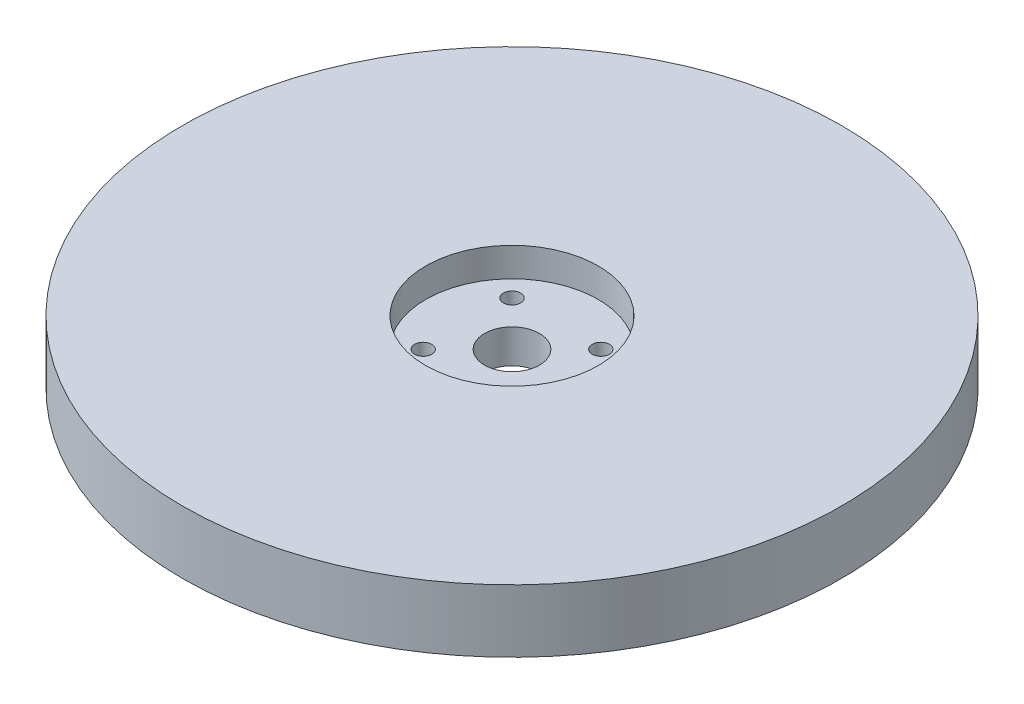
ISO-10303-21;
HEADER;
FILE_DESCRIPTION(('STEP AP214'),'2;1');
FILE_NAME('part.step','',(''),(''),'','','');
FILE_SCHEMA(('AUTOMOTIVE_DESIGN { 1 0 10303 214 1 1 1 1 }'));
ENDSEC;
DATA;
#1=APPLICATION_CONTEXT('core data for automotive mechanical design processes');
#2=APPLICATION_PROTOCOL_DEFINITION('international standard','automotive_design',2000,#1);
#3=PRODUCT_CONTEXT('',#1,'mechanical');
#4=PRODUCT('Part','Part','',(#3));
#5=PRODUCT_RELATED_PRODUCT_CATEGORY('part','',(#4));
#6=PRODUCT_DEFINITION_FORMATION('','',#4);
#7=PRODUCT_DEFINITION_CONTEXT('part definition',#1,'design');
#8=PRODUCT_DEFINITION('design','',#6,#7);
#9=PRODUCT_DEFINITION_SHAPE('','',#8);
#10=(LENGTH_UNIT() NAMED_UNIT(*) SI_UNIT(.MILLI.,.METRE.));
#11=(NAMED_UNIT(*) PLANE_ANGLE_UNIT() SI_UNIT($,.RADIAN.));
#12=(NAMED_UNIT(*) SI_UNIT($,.STERADIAN.) SOLID_ANGLE_UNIT());
#13=UNCERTAINTY_MEASURE_WITH_UNIT(LENGTH_MEASURE(1.E-05),#10,'distance_accuracy_value','');
#14=(GEOMETRIC_REPRESENTATION_CONTEXT(3) GLOBAL_UNCERTAINTY_ASSIGNED_CONTEXT((#13)) GLOBAL_UNIT_ASSIGNED_CONTEXT((#10,
#11,#12)) REPRESENTATION_CONTEXT('',''));
#15=CARTESIAN_POINT('',(0.,0.,0.));
#16=DIRECTION('',(0.,0.,1.));
#17=DIRECTION('',(1.,0.,0.));
#18=AXIS2_PLACEMENT_3D('',#15,#16,#17);
#19=CARTESIAN_POINT('',(0.,8.,0.));
#20=DIRECTION('',(0.,-1.,0.));
#21=DIRECTION('',(0.,0.,-1.));
#22=AXIS2_PLACEMENT_3D('',#19,#20,#21);
#23=CYLINDRICAL_SURFACE('',#22,3.5);
#24=CARTESIAN_POINT('',(0.,0.,0.));
#25=DIRECTION('',(0.,-1.,0.));
#26=DIRECTION('',(0.,0.,-1.));
#27=AXIS2_PLACEMENT_3D('',#24,#25,#26);
#28=CIRCLE('',#27,3.5);
#29=CARTESIAN_POINT('',(0.,0.,-3.5));
#30=VERTEX_POINT('',#29);
#31=EDGE_CURVE('E49',#30,#30,#28,.T.);
#32=ORIENTED_EDGE('',*,*,#31,.T.);
#33=EDGE_LOOP('',(#32));
#34=FACE_BOUND('',#33,.T.);
#35=CARTESIAN_POINT('',(0.,4.3,0.));
#36=DIRECTION('',(0.,1.,0.));
#37=DIRECTION('',(0.,0.,1.));
#38=AXIS2_PLACEMENT_3D('',#35,#36,#37);
#39=CIRCLE('',#38,3.5);
#40=CARTESIAN_POINT('',(0.,4.3,3.5));
#41=VERTEX_POINT('',#40);
#42=EDGE_CURVE('E41',#41,#41,#39,.F.);
#43=ORIENTED_EDGE('',*,*,#42,.F.);
#44=EDGE_LOOP('',(#43));
#45=FACE_BOUND('',#44,.T.);
#46=ADVANCED_FACE('F40',(#34,#45),#23,.F.);
#47=CARTESIAN_POINT('',(0.,8.,0.));
#48=DIRECTION('',(0.,-1.,0.));
#49=DIRECTION('',(0.,0.,-1.));
#50=AXIS2_PLACEMENT_3D('',#47,#48,#49);
#51=CYLINDRICAL_SURFACE('',#50,42.);
#52=CARTESIAN_POINT('',(0.,8.,0.));
#53=DIRECTION('',(0.,1.,0.));
#54=DIRECTION('',(0.,0.,1.));
#55=AXIS2_PLACEMENT_3D('',#52,#53,#54);
#56=CIRCLE('',#55,42.);
#57=CARTESIAN_POINT('',(0.,8.,42.));
#58=VERTEX_POINT('',#57);
#59=EDGE_CURVE('E10',#58,#58,#56,.T.);
#60=ORIENTED_EDGE('',*,*,#59,.F.);
#61=EDGE_LOOP('',(#60));
#62=FACE_BOUND('',#61,.T.);
#63=CARTESIAN_POINT('',(0.,0.,0.));
#64=DIRECTION('',(0.,1.,0.));
#65=DIRECTION('',(0.,0.,1.));
#66=AXIS2_PLACEMENT_3D('',#63,#64,#65);
#67=CIRCLE('',#66,42.);
#68=CARTESIAN_POINT('',(0.,0.,42.));
#69=VERTEX_POINT('',#68);
#70=EDGE_CURVE('E44',#69,#69,#67,.T.);
#71=ORIENTED_EDGE('',*,*,#70,.T.);
#72=EDGE_LOOP('',(#71));
#73=FACE_BOUND('',#72,.T.);
#74=ADVANCED_FACE('F39',(#62,#73),#51,.T.);
#75=CARTESIAN_POINT('',(0.,8.,0.));
#76=DIRECTION('',(0.,1.,0.));
#77=DIRECTION('',(0.,0.,1.));
#78=AXIS2_PLACEMENT_3D('',#75,#76,#77);
#79=PLANE('',#78);
#80=CARTESIAN_POINT('',(0.,8.,0.));
#81=DIRECTION('',(0.,1.,0.));
#82=DIRECTION('',(0.,0.,1.));
#83=AXIS2_PLACEMENT_3D('',#80,#81,#82);
#84=CIRCLE('',#83,11.);
#85=CARTESIAN_POINT('',(0.,8.,11.));
#86=VERTEX_POINT('',#85);
#87=EDGE_CURVE('E53',#86,#86,#84,.T.);
#88=ORIENTED_EDGE('',*,*,#87,.F.);
#89=EDGE_LOOP('',(#88));
#90=FACE_BOUND('',#89,.T.);
#91=ORIENTED_EDGE('',*,*,#59,.T.);
#92=EDGE_LOOP('',(#91));
#93=FACE_BOUND('',#92,.T.);
#94=ADVANCED_FACE('F113',(#90,#93),#79,.T.);
#95=CARTESIAN_POINT('',(0.,0.,0.));
#96=DIRECTION('',(0.,1.,0.));
#97=DIRECTION('',(0.,0.,1.));
#98=AXIS2_PLACEMENT_3D('',#95,#96,#97);
#99=PLANE('',#98);
#100=CARTESIAN_POINT('',(12.,0.,-12.));
#101=DIRECTION('',(0.,-1.,0.));
#102=DIRECTION('',(0.,0.,1.));
#103=AXIS2_PLACEMENT_3D('',#100,#101,#102);
#104=CIRCLE('',#103,1.25);
#105=CARTESIAN_POINT('',(12.,0.,-10.75));
#106=VERTEX_POINT('',#105);
#107=EDGE_CURVE('E86',#106,#106,#104,.T.);
#108=ORIENTED_EDGE('',*,*,#107,.F.);
#109=EDGE_LOOP('',(#108));
#110=FACE_BOUND('',#109,.T.);
#111=CARTESIAN_POINT('',(-24.,0.,12.));
#112=DIRECTION('',(0.,-1.,0.));
#113=DIRECTION('',(0.,0.,-1.));
#114=AXIS2_PLACEMENT_3D('',#111,#112,#113);
#115=CIRCLE('',#114,1.25);
#116=CARTESIAN_POINT('',(-24.,0.,10.75));
#117=VERTEX_POINT('',#116);
#118=EDGE_CURVE('E94',#117,#117,#115,.T.);
#119=ORIENTED_EDGE('',*,*,#118,.F.);
#120=EDGE_LOOP('',(#119));
#121=FACE_BOUND('',#120,.T.);
#122=CARTESIAN_POINT('',(-24.,0.,-12.));
#123=DIRECTION('',(0.,-1.,0.));
#124=DIRECTION('',(0.,0.,1.));
#125=AXIS2_PLACEMENT_3D('',#122,#123,#124);
#126=CIRCLE('',#125,1.25);
#127=CARTESIAN_POINT('',(-24.,0.,-10.75));
#128=VERTEX_POINT('',#127);
#129=EDGE_CURVE('E92',#128,#128,#126,.T.);
#130=ORIENTED_EDGE('',*,*,#129,.F.);
#131=EDGE_LOOP('',(#130));
#132=FACE_BOUND('',#131,.T.);
#133=CARTESIAN_POINT('',(12.,0.,12.));
#134=DIRECTION('',(0.,-1.,0.));
#135=DIRECTION('',(0.,0.,-1.));
#136=AXIS2_PLACEMENT_3D('',#133,#134,#135);
#137=CIRCLE('',#136,1.25);
#138=CARTESIAN_POINT('',(12.,0.,10.75));
#139=VERTEX_POINT('',#138);
#140=EDGE_CURVE('E84',#139,#139,#137,.T.);
#141=ORIENTED_EDGE('',*,*,#140,.F.);
#142=EDGE_LOOP('',(#141));
#143=FACE_BOUND('',#142,.T.);
#144=ORIENTED_EDGE('',*,*,#31,.F.);
#145=EDGE_LOOP('',(#144));
#146=FACE_BOUND('',#145,.T.);
#147=ORIENTED_EDGE('',*,*,#70,.F.);
#148=EDGE_LOOP('',(#147));
#149=FACE_BOUND('',#148,.T.);
#150=ADVANCED_FACE('F112',(#110,#121,#132,#143,#146,#149),#99,.F.);
#151=CARTESIAN_POINT('',(0.,4.3,0.));
#152=DIRECTION('',(0.,1.,0.));
#153=DIRECTION('',(0.,0.,1.));
#154=AXIS2_PLACEMENT_3D('',#151,#152,#153);
#155=PLANE('',#154);
#156=CARTESIAN_POINT('',(-5.66000000000006,4.3,5.65999999999994));
#157=DIRECTION('',(0.,1.,0.));
#158=DIRECTION('',(0.,0.,1.));
#159=AXIS2_PLACEMENT_3D('',#156,#157,#158);
#160=CIRCLE('',#159,1.1);
#161=CARTESIAN_POINT('',(-5.66000000000006,4.3,6.75999999999994));
#162=VERTEX_POINT('',#161);
#163=EDGE_CURVE('E69',#162,#162,#160,.T.);
#164=ORIENTED_EDGE('',*,*,#163,.F.);
#165=EDGE_LOOP('',(#164));
#166=FACE_BOUND('',#165,.T.);
#167=CARTESIAN_POINT('',(5.65999999999996,4.3,5.66000000000008));
#168=DIRECTION('',(0.,1.,0.));
#169=DIRECTION('',(0.,0.,1.));
#170=AXIS2_PLACEMENT_3D('',#167,#168,#169);
#171=CIRCLE('',#170,1.09999999999999);
#172=CARTESIAN_POINT('',(5.65999999999996,4.3,6.76000000000007));
#173=VERTEX_POINT('',#172);
#174=EDGE_CURVE('E76',#173,#173,#171,.T.);
#175=ORIENTED_EDGE('',*,*,#174,.F.);
#176=EDGE_LOOP('',(#175));
#177=FACE_BOUND('',#176,.T.);
#178=CARTESIAN_POINT('',(5.66000000000002,4.3,-5.65999999999998));
#179=DIRECTION('',(0.,1.,0.));
#180=DIRECTION('',(0.,0.,1.));
#181=AXIS2_PLACEMENT_3D('',#178,#179,#180);
#182=CIRCLE('',#181,1.1);
#183=CARTESIAN_POINT('',(5.66000000000002,4.3,-4.55999999999998));
#184=VERTEX_POINT('',#183);
#185=EDGE_CURVE('E63',#184,#184,#182,.T.);
#186=ORIENTED_EDGE('',*,*,#185,.F.);
#187=EDGE_LOOP('',(#186));
#188=FACE_BOUND('',#187,.T.);
#189=CARTESIAN_POINT('',(-5.66,4.3,-5.66));
#190=DIRECTION('',(0.,1.,0.));
#191=DIRECTION('',(0.,0.,1.));
#192=AXIS2_PLACEMENT_3D('',#189,#190,#191);
#193=CIRCLE('',#192,1.1);
#194=CARTESIAN_POINT('',(-5.66,4.3,-4.56));
#195=VERTEX_POINT('',#194);
#196=EDGE_CURVE('E64',#195,#195,#193,.T.);
#197=ORIENTED_EDGE('',*,*,#196,.F.);
#198=EDGE_LOOP('',(#197));
#199=FACE_BOUND('',#198,.T.);
#200=CARTESIAN_POINT('',(0.,4.3,0.));
#201=DIRECTION('',(0.,1.,0.));
#202=DIRECTION('',(0.,0.,1.));
#203=AXIS2_PLACEMENT_3D('',#200,#201,#202);
#204=CIRCLE('',#203,11.);
#205=CARTESIAN_POINT('',(0.,4.3,11.));
#206=VERTEX_POINT('',#205);
#207=EDGE_CURVE('E60',#206,#206,#204,.T.);
#208=ORIENTED_EDGE('',*,*,#207,.T.);
#209=EDGE_LOOP('',(#208));
#210=FACE_BOUND('',#209,.T.);
#211=ORIENTED_EDGE('',*,*,#42,.T.);
#212=EDGE_LOOP('',(#211));
#213=FACE_BOUND('',#212,.T.);
#214=ADVANCED_FACE('F111',(#166,#177,#188,#199,#210,#213),#155,.T.);
#215=CARTESIAN_POINT('',(0.,4.3,0.));
#216=DIRECTION('',(0.,1.,0.));
#217=DIRECTION('',(0.,0.,1.));
#218=AXIS2_PLACEMENT_3D('',#215,#216,#217);
#219=CYLINDRICAL_SURFACE('',#218,11.);
#220=ORIENTED_EDGE('',*,*,#207,.F.);
#221=EDGE_LOOP('',(#220));
#222=FACE_BOUND('',#221,.T.);
#223=ORIENTED_EDGE('',*,*,#87,.T.);
#224=EDGE_LOOP('',(#223));
#225=FACE_BOUND('',#224,.T.);
#226=ADVANCED_FACE('F140',(#222,#225),#219,.F.);
#227=CARTESIAN_POINT('',(-5.66,1.3,-5.66));
#228=DIRECTION('',(0.,1.,0.));
#229=DIRECTION('',(0.,0.,1.));
#230=AXIS2_PLACEMENT_3D('',#227,#228,#229);
#231=CYLINDRICAL_SURFACE('',#230,1.1);
#232=CARTESIAN_POINT('',(-5.66,1.3,-5.66));
#233=DIRECTION('',(0.,1.,0.));
#234=DIRECTION('',(0.,0.,1.));
#235=AXIS2_PLACEMENT_3D('',#232,#233,#234);
#236=CIRCLE('',#235,1.1);
#237=CARTESIAN_POINT('',(-5.66,1.3,-4.56));
#238=VERTEX_POINT('',#237);
#239=EDGE_CURVE('E59',#238,#238,#236,.T.);
#240=ORIENTED_EDGE('',*,*,#239,.F.);
#241=EDGE_LOOP('',(#240));
#242=FACE_BOUND('',#241,.T.);
#243=ORIENTED_EDGE('',*,*,#196,.T.);
#244=EDGE_LOOP('',(#243));
#245=FACE_BOUND('',#244,.T.);
#246=ADVANCED_FACE('F139',(#242,#245),#231,.F.);
#247=CARTESIAN_POINT('',(-5.66,1.3,-5.66));
#248=DIRECTION('',(0.,1.,0.));
#249=DIRECTION('',(0.,0.,1.));
#250=AXIS2_PLACEMENT_3D('',#247,#248,#249);
#251=PLANE('',#250);
#252=ORIENTED_EDGE('',*,*,#239,.T.);
#253=EDGE_LOOP('',(#252));
#254=FACE_BOUND('',#253,.T.);
#255=ADVANCED_FACE('F150',(#254),#251,.T.);
#256=CARTESIAN_POINT('',(5.66000000000002,1.3,-5.65999999999998));
#257=DIRECTION('',(0.,1.,0.));
#258=DIRECTION('',(0.,0.,1.));
#259=AXIS2_PLACEMENT_3D('',#256,#257,#258);
#260=CYLINDRICAL_SURFACE('',#259,1.1);
#261=CARTESIAN_POINT('',(5.66000000000002,1.3,-5.65999999999998));
#262=DIRECTION('',(0.,1.,0.));
#263=DIRECTION('',(0.,0.,1.));
#264=AXIS2_PLACEMENT_3D('',#261,#262,#263);
#265=CIRCLE('',#264,1.1);
#266=CARTESIAN_POINT('',(5.66000000000002,1.3,-4.55999999999998));
#267=VERTEX_POINT('',#266);
#268=EDGE_CURVE('E77',#267,#267,#265,.T.);
#269=ORIENTED_EDGE('',*,*,#268,.F.);
#270=EDGE_LOOP('',(#269));
#271=FACE_BOUND('',#270,.T.);
#272=ORIENTED_EDGE('',*,*,#185,.T.);
#273=EDGE_LOOP('',(#272));
#274=FACE_BOUND('',#273,.T.);
#275=ADVANCED_FACE('F151',(#271,#274),#260,.F.);
#276=CARTESIAN_POINT('',(5.66000000000002,1.3,-5.65999999999998));
#277=DIRECTION('',(0.,1.,0.));
#278=DIRECTION('',(0.,0.,1.));
#279=AXIS2_PLACEMENT_3D('',#276,#277,#278);
#280=PLANE('',#279);
#281=ORIENTED_EDGE('',*,*,#268,.T.);
#282=EDGE_LOOP('',(#281));
#283=FACE_BOUND('',#282,.T.);
#284=ADVANCED_FACE('F166',(#283),#280,.T.);
#285=CARTESIAN_POINT('',(5.65999999999996,1.3,5.66000000000008));
#286=DIRECTION('',(0.,1.,0.));
#287=DIRECTION('',(0.,0.,1.));
#288=AXIS2_PLACEMENT_3D('',#285,#286,#287);
#289=CYLINDRICAL_SURFACE('',#288,1.09999999999999);
#290=CARTESIAN_POINT('',(5.65999999999996,1.3,5.66000000000008));
#291=DIRECTION('',(0.,1.,0.));
#292=DIRECTION('',(0.,0.,1.));
#293=AXIS2_PLACEMENT_3D('',#290,#291,#292);
#294=CIRCLE('',#293,1.09999999999999);
#295=CARTESIAN_POINT('',(5.65999999999996,1.3,6.76000000000007));
#296=VERTEX_POINT('',#295);
#297=EDGE_CURVE('E74',#296,#296,#294,.T.);
#298=ORIENTED_EDGE('',*,*,#297,.F.);
#299=EDGE_LOOP('',(#298));
#300=FACE_BOUND('',#299,.T.);
#301=ORIENTED_EDGE('',*,*,#174,.T.);
#302=EDGE_LOOP('',(#301));
#303=FACE_BOUND('',#302,.T.);
#304=ADVANCED_FACE('F164',(#300,#303),#289,.F.);
#305=CARTESIAN_POINT('',(5.65999999999996,1.3,5.66000000000008));
#306=DIRECTION('',(0.,1.,0.));
#307=DIRECTION('',(0.,0.,1.));
#308=AXIS2_PLACEMENT_3D('',#305,#306,#307);
#309=PLANE('',#308);
#310=ORIENTED_EDGE('',*,*,#297,.T.);
#311=EDGE_LOOP('',(#310));
#312=FACE_BOUND('',#311,.T.);
#313=ADVANCED_FACE('F161',(#312),#309,.T.);
#314=CARTESIAN_POINT('',(-5.66000000000006,1.3,5.65999999999994));
#315=DIRECTION('',(0.,1.,0.));
#316=DIRECTION('',(0.,0.,1.));
#317=AXIS2_PLACEMENT_3D('',#314,#315,#316);
#318=CYLINDRICAL_SURFACE('',#317,1.1);
#319=CARTESIAN_POINT('',(-5.66000000000006,1.3,5.65999999999994));
#320=DIRECTION('',(0.,1.,0.));
#321=DIRECTION('',(0.,0.,1.));
#322=AXIS2_PLACEMENT_3D('',#319,#320,#321);
#323=CIRCLE('',#322,1.1);
#324=CARTESIAN_POINT('',(-5.66000000000006,1.3,6.75999999999994));
#325=VERTEX_POINT('',#324);
#326=EDGE_CURVE('E70',#325,#325,#323,.T.);
#327=ORIENTED_EDGE('',*,*,#326,.F.);
#328=EDGE_LOOP('',(#327));
#329=FACE_BOUND('',#328,.T.);
#330=ORIENTED_EDGE('',*,*,#163,.T.);
#331=EDGE_LOOP('',(#330));
#332=FACE_BOUND('',#331,.T.);
#333=ADVANCED_FACE('F160',(#329,#332),#318,.F.);
#334=CARTESIAN_POINT('',(-5.66000000000006,1.3,5.65999999999994));
#335=DIRECTION('',(0.,1.,0.));
#336=DIRECTION('',(0.,0.,1.));
#337=AXIS2_PLACEMENT_3D('',#334,#335,#336);
#338=PLANE('',#337);
#339=ORIENTED_EDGE('',*,*,#326,.T.);
#340=EDGE_LOOP('',(#339));
#341=FACE_BOUND('',#340,.T.);
#342=ADVANCED_FACE('F153',(#341),#338,.T.);
#343=CARTESIAN_POINT('',(12.,6.,12.));
#344=DIRECTION('',(0.,-1.,0.));
#345=DIRECTION('',(0.,0.,-1.));
#346=AXIS2_PLACEMENT_3D('',#343,#344,#345);
#347=CYLINDRICAL_SURFACE('',#346,1.25);
#348=CARTESIAN_POINT('',(12.,6.,12.));
#349=DIRECTION('',(0.,-1.,0.));
#350=DIRECTION('',(0.,0.,-1.));
#351=AXIS2_PLACEMENT_3D('',#348,#349,#350);
#352=CIRCLE('',#351,1.25);
#353=CARTESIAN_POINT('',(12.,6.,10.75));
#354=VERTEX_POINT('',#353);
#355=EDGE_CURVE('E72',#354,#354,#352,.T.);
#356=ORIENTED_EDGE('',*,*,#355,.F.);
#357=EDGE_LOOP('',(#356));
#358=FACE_BOUND('',#357,.T.);
#359=ORIENTED_EDGE('',*,*,#140,.T.);
#360=EDGE_LOOP('',(#359));
#361=FACE_BOUND('',#360,.T.);
#362=ADVANCED_FACE('F156',(#358,#361),#347,.F.);
#363=CARTESIAN_POINT('',(12.,6.,12.));
#364=DIRECTION('',(0.,-1.,0.));
#365=DIRECTION('',(0.,0.,-1.));
#366=AXIS2_PLACEMENT_3D('',#363,#364,#365);
#367=PLANE('',#366);
#368=ORIENTED_EDGE('',*,*,#355,.T.);
#369=EDGE_LOOP('',(#368));
#370=FACE_BOUND('',#369,.T.);
#371=ADVANCED_FACE('F178',(#370),#367,.T.);
#372=CARTESIAN_POINT('',(-24.,6.,-12.));
#373=DIRECTION('',(0.,-1.,0.));
#374=DIRECTION('',(0.,0.,-1.));
#375=AXIS2_PLACEMENT_3D('',#372,#373,#374);
#376=CYLINDRICAL_SURFACE('',#375,1.25);
#377=CARTESIAN_POINT('',(-24.,6.,-12.));
#378=DIRECTION('',(0.,-1.,0.));
#379=DIRECTION('',(0.,0.,1.));
#380=AXIS2_PLACEMENT_3D('',#377,#378,#379);
#381=CIRCLE('',#380,1.25);
#382=CARTESIAN_POINT('',(-24.,6.,-10.75));
#383=VERTEX_POINT('',#382);
#384=EDGE_CURVE('E103',#383,#383,#381,.T.);
#385=ORIENTED_EDGE('',*,*,#384,.F.);
#386=EDGE_LOOP('',(#385));
#387=FACE_BOUND('',#386,.T.);
#388=ORIENTED_EDGE('',*,*,#129,.T.);
#389=EDGE_LOOP('',(#388));
#390=FACE_BOUND('',#389,.T.);
#391=ADVANCED_FACE('F108',(#387,#390),#376,.F.);
#392=CARTESIAN_POINT('',(-24.,6.,-12.));
#393=DIRECTION('',(0.,1.,0.));
#394=DIRECTION('',(0.,0.,1.));
#395=AXIS2_PLACEMENT_3D('',#392,#393,#394);
#396=PLANE('',#395);
#397=ORIENTED_EDGE('',*,*,#384,.T.);
#398=EDGE_LOOP('',(#397));
#399=FACE_BOUND('',#398,.T.);
#400=ADVANCED_FACE('F195',(#399),#396,.F.);
#401=CARTESIAN_POINT('',(-24.,6.,12.));
#402=DIRECTION('',(0.,-1.,0.));
#403=DIRECTION('',(0.,0.,-1.));
#404=AXIS2_PLACEMENT_3D('',#401,#402,#403);
#405=CYLINDRICAL_SURFACE('',#404,1.25);
#406=CARTESIAN_POINT('',(-24.,6.,12.));
#407=DIRECTION('',(0.,-1.,0.));
#408=DIRECTION('',(0.,0.,-1.));
#409=AXIS2_PLACEMENT_3D('',#406,#407,#408);
#410=CIRCLE('',#409,1.25);
#411=CARTESIAN_POINT('',(-24.,6.,10.75));
#412=VERTEX_POINT('',#411);
#413=EDGE_CURVE('E93',#412,#412,#410,.T.);
#414=ORIENTED_EDGE('',*,*,#413,.F.);
#415=EDGE_LOOP('',(#414));
#416=FACE_BOUND('',#415,.T.);
#417=ORIENTED_EDGE('',*,*,#118,.T.);
#418=EDGE_LOOP('',(#417));
#419=FACE_BOUND('',#418,.T.);
#420=ADVANCED_FACE('F190',(#416,#419),#405,.F.);
#421=CARTESIAN_POINT('',(-24.,6.,12.));
#422=DIRECTION('',(0.,-1.,0.));
#423=DIRECTION('',(0.,0.,-1.));
#424=AXIS2_PLACEMENT_3D('',#421,#422,#423);
#425=PLANE('',#424);
#426=ORIENTED_EDGE('',*,*,#413,.T.);
#427=EDGE_LOOP('',(#426));
#428=FACE_BOUND('',#427,.T.);
#429=ADVANCED_FACE('F184',(#428),#425,.T.);
#430=CARTESIAN_POINT('',(12.,6.,-12.));
#431=DIRECTION('',(0.,-1.,0.));
#432=DIRECTION('',(0.,0.,-1.));
#433=AXIS2_PLACEMENT_3D('',#430,#431,#432);
#434=CYLINDRICAL_SURFACE('',#433,1.25);
#435=CARTESIAN_POINT('',(12.,6.,-12.));
#436=DIRECTION('',(0.,-1.,0.));
#437=DIRECTION('',(0.,0.,1.));
#438=AXIS2_PLACEMENT_3D('',#435,#436,#437);
#439=CIRCLE('',#438,1.25);
#440=CARTESIAN_POINT('',(12.,6.,-10.75));
#441=VERTEX_POINT('',#440);
#442=EDGE_CURVE('E98',#441,#441,#439,.T.);
#443=ORIENTED_EDGE('',*,*,#442,.F.);
#444=EDGE_LOOP('',(#443));
#445=FACE_BOUND('',#444,.T.);
#446=ORIENTED_EDGE('',*,*,#107,.T.);
#447=EDGE_LOOP('',(#446));
#448=FACE_BOUND('',#447,.T.);
#449=ADVANCED_FACE('F186',(#445,#448),#434,.F.);
#450=CARTESIAN_POINT('',(12.,6.,-12.));
#451=DIRECTION('',(0.,1.,0.));
#452=DIRECTION('',(0.,0.,1.));
#453=AXIS2_PLACEMENT_3D('',#450,#451,#452);
#454=PLANE('',#453);
#455=ORIENTED_EDGE('',*,*,#442,.T.);
#456=EDGE_LOOP('',(#455));
#457=FACE_BOUND('',#456,.T.);
#458=ADVANCED_FACE('F193',(#457),#454,.F.);
#459=CLOSED_SHELL('',(#46,#74,#94,#150,#214,#226,#246,#255,#275,#284,#304,#313,#333,#342,#362,
#371,#391,#400,#420,#429,#449,#458));
#460=MANIFOLD_SOLID_BREP('B2',#459);
#461=ADVANCED_BREP_SHAPE_REPRESENTATION('',(#18,#460),#14);
#462=SHAPE_DEFINITION_REPRESENTATION(#9,#461);
ENDSEC;
END-ISO-10303-21;
